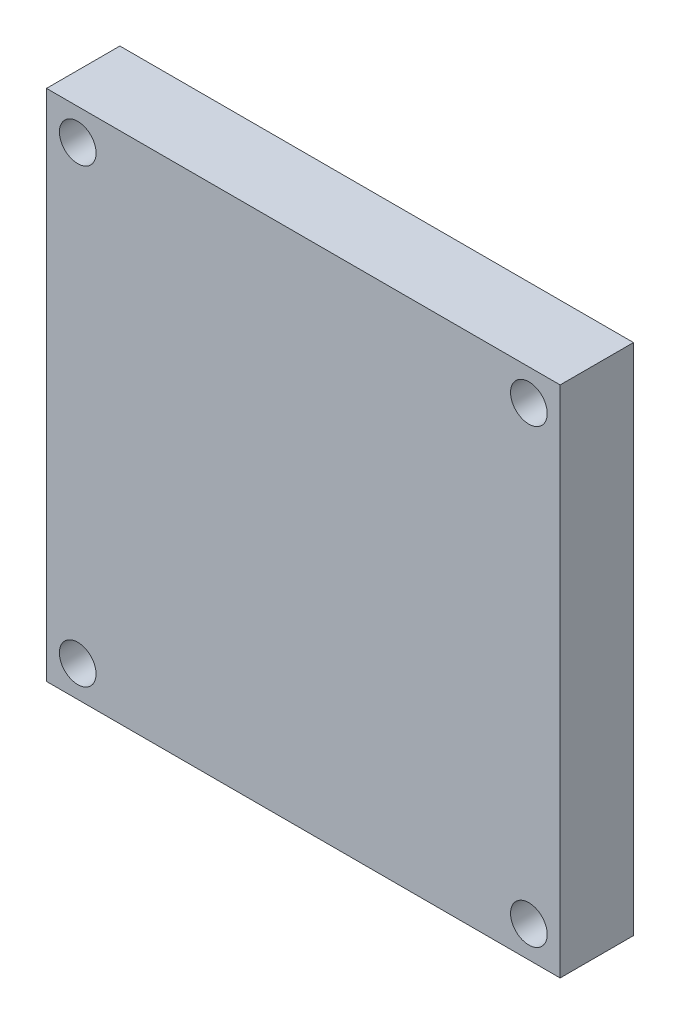
ISO-10303-21;
HEADER;
FILE_DESCRIPTION(('STEP AP214'),'2;1');
FILE_NAME('part.step','',(''),(''),'','','');
FILE_SCHEMA(('AUTOMOTIVE_DESIGN { 1 0 10303 214 1 1 1 1 }'));
ENDSEC;
DATA;
#1=APPLICATION_CONTEXT('core data for automotive mechanical design processes');
#2=APPLICATION_PROTOCOL_DEFINITION('international standard','automotive_design',2000,#1);
#3=PRODUCT_CONTEXT('',#1,'mechanical');
#4=PRODUCT('Part','Part','',(#3));
#5=PRODUCT_RELATED_PRODUCT_CATEGORY('part','',(#4));
#6=PRODUCT_DEFINITION_FORMATION('','',#4);
#7=PRODUCT_DEFINITION_CONTEXT('part definition',#1,'design');
#8=PRODUCT_DEFINITION('design','',#6,#7);
#9=PRODUCT_DEFINITION_SHAPE('','',#8);
#10=(LENGTH_UNIT() NAMED_UNIT(*) SI_UNIT(.MILLI.,.METRE.));
#11=(NAMED_UNIT(*) PLANE_ANGLE_UNIT() SI_UNIT($,.RADIAN.));
#12=(NAMED_UNIT(*) SI_UNIT($,.STERADIAN.) SOLID_ANGLE_UNIT());
#13=UNCERTAINTY_MEASURE_WITH_UNIT(LENGTH_MEASURE(1.E-05),#10,'distance_accuracy_value','');
#14=(GEOMETRIC_REPRESENTATION_CONTEXT(3) GLOBAL_UNCERTAINTY_ASSIGNED_CONTEXT((#13)) GLOBAL_UNIT_ASSIGNED_CONTEXT((#10,
#11,#12)) REPRESENTATION_CONTEXT('',''));
#15=CARTESIAN_POINT('',(0.,0.,0.));
#16=DIRECTION('',(0.,0.,1.));
#17=DIRECTION('',(1.,0.,0.));
#18=AXIS2_PLACEMENT_3D('',#15,#16,#17);
#19=CARTESIAN_POINT('',(0.,0.,5.));
#20=DIRECTION('',(0.,0.,1.));
#21=DIRECTION('',(1.,0.,0.));
#22=AXIS2_PLACEMENT_3D('',#19,#20,#21);
#23=PLANE('',#22);
#24=CARTESIAN_POINT('',(-15.37,15.37,5.));
#25=DIRECTION('',(0.,0.,1.));
#26=DIRECTION('',(1.,0.,0.));
#27=AXIS2_PLACEMENT_3D('',#24,#25,#26);
#28=CIRCLE('',#27,1.25);
#29=CARTESIAN_POINT('',(-14.12,15.37,5.));
#30=VERTEX_POINT('',#29);
#31=EDGE_CURVE('E121',#30,#30,#28,.T.);
#32=ORIENTED_EDGE('',*,*,#31,.F.);
#33=EDGE_LOOP('',(#32));
#34=FACE_BOUND('',#33,.T.);
#35=CARTESIAN_POINT('',(15.37,-15.37,5.));
#36=DIRECTION('',(0.,0.,1.));
#37=DIRECTION('',(1.,0.,0.));
#38=AXIS2_PLACEMENT_3D('',#35,#36,#37);
#39=CIRCLE('',#38,1.25);
#40=CARTESIAN_POINT('',(16.62,-15.37,5.));
#41=VERTEX_POINT('',#40);
#42=EDGE_CURVE('E100',#41,#41,#39,.T.);
#43=ORIENTED_EDGE('',*,*,#42,.F.);
#44=EDGE_LOOP('',(#43));
#45=FACE_BOUND('',#44,.T.);
#46=DIRECTION('',(0.,-1.,0.));
#47=VECTOR('',#46,1.);
#48=CARTESIAN_POINT('',(-17.5,-17.5,5.));
#49=LINE('',#48,#47);
#50=CARTESIAN_POINT('',(-17.5,17.5,5.));
#51=VERTEX_POINT('',#50);
#52=CARTESIAN_POINT('',(-17.5,-17.5,5.));
#53=VERTEX_POINT('',#52);
#54=EDGE_CURVE('E85',#51,#53,#49,.T.);
#55=ORIENTED_EDGE('',*,*,#54,.T.);
#56=DIRECTION('',(1.,0.,0.));
#57=VECTOR('',#56,1.);
#58=CARTESIAN_POINT('',(17.5,-17.5,5.));
#59=LINE('',#58,#57);
#60=CARTESIAN_POINT('',(17.5,-17.5,5.));
#61=VERTEX_POINT('',#60);
#62=EDGE_CURVE('E80',#53,#61,#59,.T.);
#63=ORIENTED_EDGE('',*,*,#62,.T.);
#64=DIRECTION('',(0.,1.,0.));
#65=VECTOR('',#64,1.);
#66=CARTESIAN_POINT('',(17.5,-17.5,5.));
#67=LINE('',#66,#65);
#68=CARTESIAN_POINT('',(17.5,17.5,5.));
#69=VERTEX_POINT('',#68);
#70=EDGE_CURVE('E83',#61,#69,#67,.T.);
#71=ORIENTED_EDGE('',*,*,#70,.T.);
#72=DIRECTION('',(-1.,0.,0.));
#73=VECTOR('',#72,1.);
#74=CARTESIAN_POINT('',(17.5,17.5,5.));
#75=LINE('',#74,#73);
#76=EDGE_CURVE('E50',#69,#51,#75,.T.);
#77=ORIENTED_EDGE('',*,*,#76,.T.);
#78=EDGE_LOOP('',(#55,#63,#71,#77));
#79=FACE_BOUND('',#78,.T.);
#80=CARTESIAN_POINT('',(-15.37,-15.37,5.));
#81=DIRECTION('',(0.,0.,1.));
#82=DIRECTION('',(1.,0.,0.));
#83=AXIS2_PLACEMENT_3D('',#80,#81,#82);
#84=CIRCLE('',#83,1.25);
#85=CARTESIAN_POINT('',(-14.12,-15.37,5.));
#86=VERTEX_POINT('',#85);
#87=EDGE_CURVE('E115',#86,#86,#84,.T.);
#88=ORIENTED_EDGE('',*,*,#87,.F.);
#89=EDGE_LOOP('',(#88));
#90=FACE_BOUND('',#89,.T.);
#91=CARTESIAN_POINT('',(15.37,15.37,5.));
#92=DIRECTION('',(0.,0.,1.));
#93=DIRECTION('',(1.,0.,0.));
#94=AXIS2_PLACEMENT_3D('',#91,#92,#93);
#95=CIRCLE('',#94,1.25);
#96=CARTESIAN_POINT('',(16.62,15.37,5.));
#97=VERTEX_POINT('',#96);
#98=EDGE_CURVE('E127',#97,#97,#95,.T.);
#99=ORIENTED_EDGE('',*,*,#98,.F.);
#100=EDGE_LOOP('',(#99));
#101=FACE_BOUND('',#100,.T.);
#102=ADVANCED_FACE('F33',(#34,#45,#79,#90,#101),#23,.T.);
#103=CARTESIAN_POINT('',(0.,0.,0.));
#104=DIRECTION('',(0.,0.,1.));
#105=DIRECTION('',(1.,0.,0.));
#106=AXIS2_PLACEMENT_3D('',#103,#104,#105);
#107=PLANE('',#106);
#108=DIRECTION('',(0.,-1.,0.));
#109=VECTOR('',#108,1.);
#110=CARTESIAN_POINT('',(-17.5,-17.5,0.));
#111=LINE('',#110,#109);
#112=CARTESIAN_POINT('',(-17.5,17.5,0.));
#113=VERTEX_POINT('',#112);
#114=CARTESIAN_POINT('',(-17.5,-17.5,0.));
#115=VERTEX_POINT('',#114);
#116=EDGE_CURVE('E97',#113,#115,#111,.T.);
#117=ORIENTED_EDGE('',*,*,#116,.F.);
#118=DIRECTION('',(-1.,0.,0.));
#119=VECTOR('',#118,1.);
#120=CARTESIAN_POINT('',(17.5,17.5,0.));
#121=LINE('',#120,#119);
#122=CARTESIAN_POINT('',(17.5,17.5,0.));
#123=VERTEX_POINT('',#122);
#124=EDGE_CURVE('E73',#123,#113,#121,.T.);
#125=ORIENTED_EDGE('',*,*,#124,.F.);
#126=DIRECTION('',(0.,1.,0.));
#127=VECTOR('',#126,1.);
#128=CARTESIAN_POINT('',(17.5,-17.5,0.));
#129=LINE('',#128,#127);
#130=CARTESIAN_POINT('',(17.5,-17.5,0.));
#131=VERTEX_POINT('',#130);
#132=EDGE_CURVE('E67',#131,#123,#129,.T.);
#133=ORIENTED_EDGE('',*,*,#132,.F.);
#134=DIRECTION('',(1.,0.,0.));
#135=VECTOR('',#134,1.);
#136=CARTESIAN_POINT('',(17.5,-17.5,0.));
#137=LINE('',#136,#135);
#138=EDGE_CURVE('E89',#115,#131,#137,.T.);
#139=ORIENTED_EDGE('',*,*,#138,.F.);
#140=EDGE_LOOP('',(#117,#125,#133,#139));
#141=FACE_BOUND('',#140,.T.);
#142=CARTESIAN_POINT('',(15.37,-15.37,0.));
#143=DIRECTION('',(0.,0.,1.));
#144=DIRECTION('',(1.,0.,0.));
#145=AXIS2_PLACEMENT_3D('',#142,#143,#144);
#146=CIRCLE('',#145,1.25);
#147=CARTESIAN_POINT('',(16.62,-15.37,0.));
#148=VERTEX_POINT('',#147);
#149=EDGE_CURVE('E112',#148,#148,#146,.T.);
#150=ORIENTED_EDGE('',*,*,#149,.T.);
#151=EDGE_LOOP('',(#150));
#152=FACE_BOUND('',#151,.T.);
#153=CARTESIAN_POINT('',(-15.37,-15.37,0.));
#154=DIRECTION('',(0.,0.,1.));
#155=DIRECTION('',(1.,0.,0.));
#156=AXIS2_PLACEMENT_3D('',#153,#154,#155);
#157=CIRCLE('',#156,1.25);
#158=CARTESIAN_POINT('',(-14.12,-15.37,0.));
#159=VERTEX_POINT('',#158);
#160=EDGE_CURVE('E118',#159,#159,#157,.T.);
#161=ORIENTED_EDGE('',*,*,#160,.T.);
#162=EDGE_LOOP('',(#161));
#163=FACE_BOUND('',#162,.T.);
#164=CARTESIAN_POINT('',(-15.37,15.37,0.));
#165=DIRECTION('',(0.,0.,1.));
#166=DIRECTION('',(1.,0.,0.));
#167=AXIS2_PLACEMENT_3D('',#164,#165,#166);
#168=CIRCLE('',#167,1.25);
#169=CARTESIAN_POINT('',(-14.12,15.37,0.));
#170=VERTEX_POINT('',#169);
#171=EDGE_CURVE('E124',#170,#170,#168,.T.);
#172=ORIENTED_EDGE('',*,*,#171,.T.);
#173=EDGE_LOOP('',(#172));
#174=FACE_BOUND('',#173,.T.);
#175=CARTESIAN_POINT('',(15.37,15.37,0.));
#176=DIRECTION('',(0.,0.,1.));
#177=DIRECTION('',(1.,0.,0.));
#178=AXIS2_PLACEMENT_3D('',#175,#176,#177);
#179=CIRCLE('',#178,1.25);
#180=CARTESIAN_POINT('',(16.62,15.37,0.));
#181=VERTEX_POINT('',#180);
#182=EDGE_CURVE('E130',#181,#181,#179,.T.);
#183=ORIENTED_EDGE('',*,*,#182,.T.);
#184=EDGE_LOOP('',(#183));
#185=FACE_BOUND('',#184,.T.);
#186=ADVANCED_FACE('F108',(#141,#152,#163,#174,#185),#107,.F.);
#187=CARTESIAN_POINT('',(-17.5,-17.5,5.));
#188=DIRECTION('',(1.,0.,0.));
#189=DIRECTION('',(0.,1.,0.));
#190=AXIS2_PLACEMENT_3D('',#187,#188,#189);
#191=PLANE('',#190);
#192=ORIENTED_EDGE('',*,*,#116,.T.);
#193=DIRECTION('',(0.,0.,-1.));
#194=VECTOR('',#193,1.);
#195=CARTESIAN_POINT('',(-17.5,-17.5,5.));
#196=LINE('',#195,#194);
#197=EDGE_CURVE('E11',#53,#115,#196,.T.);
#198=ORIENTED_EDGE('',*,*,#197,.F.);
#199=ORIENTED_EDGE('',*,*,#54,.F.);
#200=DIRECTION('',(0.,0.,-1.));
#201=VECTOR('',#200,1.);
#202=CARTESIAN_POINT('',(-17.5,17.5,5.));
#203=LINE('',#202,#201);
#204=EDGE_CURVE('E93',#51,#113,#203,.T.);
#205=ORIENTED_EDGE('',*,*,#204,.T.);
#206=EDGE_LOOP('',(#192,#198,#199,#205));
#207=FACE_BOUND('',#206,.T.);
#208=ADVANCED_FACE('F35',(#207),#191,.F.);
#209=CARTESIAN_POINT('',(17.5,-17.5,5.));
#210=DIRECTION('',(0.,1.,0.));
#211=DIRECTION('',(-1.,0.,0.));
#212=AXIS2_PLACEMENT_3D('',#209,#210,#211);
#213=PLANE('',#212);
#214=ORIENTED_EDGE('',*,*,#138,.T.);
#215=DIRECTION('',(0.,0.,-1.));
#216=VECTOR('',#215,1.);
#217=CARTESIAN_POINT('',(17.5,-17.5,5.));
#218=LINE('',#217,#216);
#219=EDGE_CURVE('E42',#61,#131,#218,.T.);
#220=ORIENTED_EDGE('',*,*,#219,.F.);
#221=ORIENTED_EDGE('',*,*,#62,.F.);
#222=ORIENTED_EDGE('',*,*,#197,.T.);
#223=EDGE_LOOP('',(#214,#220,#221,#222));
#224=FACE_BOUND('',#223,.T.);
#225=ADVANCED_FACE('F88',(#224),#213,.F.);
#226=CARTESIAN_POINT('',(17.5,-17.5,5.));
#227=DIRECTION('',(-1.,0.,0.));
#228=DIRECTION('',(0.,0.,1.));
#229=AXIS2_PLACEMENT_3D('',#226,#227,#228);
#230=PLANE('',#229);
#231=ORIENTED_EDGE('',*,*,#132,.T.);
#232=DIRECTION('',(0.,0.,-1.));
#233=VECTOR('',#232,1.);
#234=CARTESIAN_POINT('',(17.5,17.5,5.));
#235=LINE('',#234,#233);
#236=EDGE_CURVE('E90',#69,#123,#235,.T.);
#237=ORIENTED_EDGE('',*,*,#236,.F.);
#238=ORIENTED_EDGE('',*,*,#70,.F.);
#239=ORIENTED_EDGE('',*,*,#219,.T.);
#240=EDGE_LOOP('',(#231,#237,#238,#239));
#241=FACE_BOUND('',#240,.T.);
#242=ADVANCED_FACE('F91',(#241),#230,.F.);
#243=CARTESIAN_POINT('',(17.5,17.5,5.));
#244=DIRECTION('',(0.,-1.,0.));
#245=DIRECTION('',(0.,0.,-1.));
#246=AXIS2_PLACEMENT_3D('',#243,#244,#245);
#247=PLANE('',#246);
#248=ORIENTED_EDGE('',*,*,#124,.T.);
#249=ORIENTED_EDGE('',*,*,#204,.F.);
#250=ORIENTED_EDGE('',*,*,#76,.F.);
#251=ORIENTED_EDGE('',*,*,#236,.T.);
#252=EDGE_LOOP('',(#248,#249,#250,#251));
#253=FACE_BOUND('',#252,.T.);
#254=ADVANCED_FACE('F105',(#253),#247,.F.);
#255=CARTESIAN_POINT('',(15.37,-15.37,5.));
#256=DIRECTION('',(0.,0.,-1.));
#257=DIRECTION('',(-1.,0.,0.));
#258=AXIS2_PLACEMENT_3D('',#255,#256,#257);
#259=CYLINDRICAL_SURFACE('',#258,1.25);
#260=ORIENTED_EDGE('',*,*,#42,.T.);
#261=EDGE_LOOP('',(#260));
#262=FACE_BOUND('',#261,.T.);
#263=ORIENTED_EDGE('',*,*,#149,.F.);
#264=EDGE_LOOP('',(#263));
#265=FACE_BOUND('',#264,.T.);
#266=ADVANCED_FACE('F149',(#262,#265),#259,.F.);
#267=CARTESIAN_POINT('',(-15.37,-15.37,5.));
#268=DIRECTION('',(0.,0.,-1.));
#269=DIRECTION('',(-1.,0.,0.));
#270=AXIS2_PLACEMENT_3D('',#267,#268,#269);
#271=CYLINDRICAL_SURFACE('',#270,1.25);
#272=ORIENTED_EDGE('',*,*,#87,.T.);
#273=EDGE_LOOP('',(#272));
#274=FACE_BOUND('',#273,.T.);
#275=ORIENTED_EDGE('',*,*,#160,.F.);
#276=EDGE_LOOP('',(#275));
#277=FACE_BOUND('',#276,.T.);
#278=ADVANCED_FACE('F195',(#274,#277),#271,.F.);
#279=CARTESIAN_POINT('',(-15.37,15.37,5.));
#280=DIRECTION('',(0.,0.,-1.));
#281=DIRECTION('',(-1.,0.,0.));
#282=AXIS2_PLACEMENT_3D('',#279,#280,#281);
#283=CYLINDRICAL_SURFACE('',#282,1.25);
#284=ORIENTED_EDGE('',*,*,#31,.T.);
#285=EDGE_LOOP('',(#284));
#286=FACE_BOUND('',#285,.T.);
#287=ORIENTED_EDGE('',*,*,#171,.F.);
#288=EDGE_LOOP('',(#287));
#289=FACE_BOUND('',#288,.T.);
#290=ADVANCED_FACE('F203',(#286,#289),#283,.F.);
#291=CARTESIAN_POINT('',(15.37,15.37,5.));
#292=DIRECTION('',(0.,0.,-1.));
#293=DIRECTION('',(-1.,0.,0.));
#294=AXIS2_PLACEMENT_3D('',#291,#292,#293);
#295=CYLINDRICAL_SURFACE('',#294,1.25);
#296=ORIENTED_EDGE('',*,*,#98,.T.);
#297=EDGE_LOOP('',(#296));
#298=FACE_BOUND('',#297,.T.);
#299=ORIENTED_EDGE('',*,*,#182,.F.);
#300=EDGE_LOOP('',(#299));
#301=FACE_BOUND('',#300,.T.);
#302=ADVANCED_FACE('F136',(#298,#301),#295,.F.);
#303=CLOSED_SHELL('',(#102,#186,#208,#225,#242,#254,#266,#278,#290,#302));
#304=MANIFOLD_SOLID_BREP('B2',#303);
#305=ADVANCED_BREP_SHAPE_REPRESENTATION('',(#18,#304),#14);
#306=SHAPE_DEFINITION_REPRESENTATION(#9,#305);
ENDSEC;
END-ISO-10303-21;
